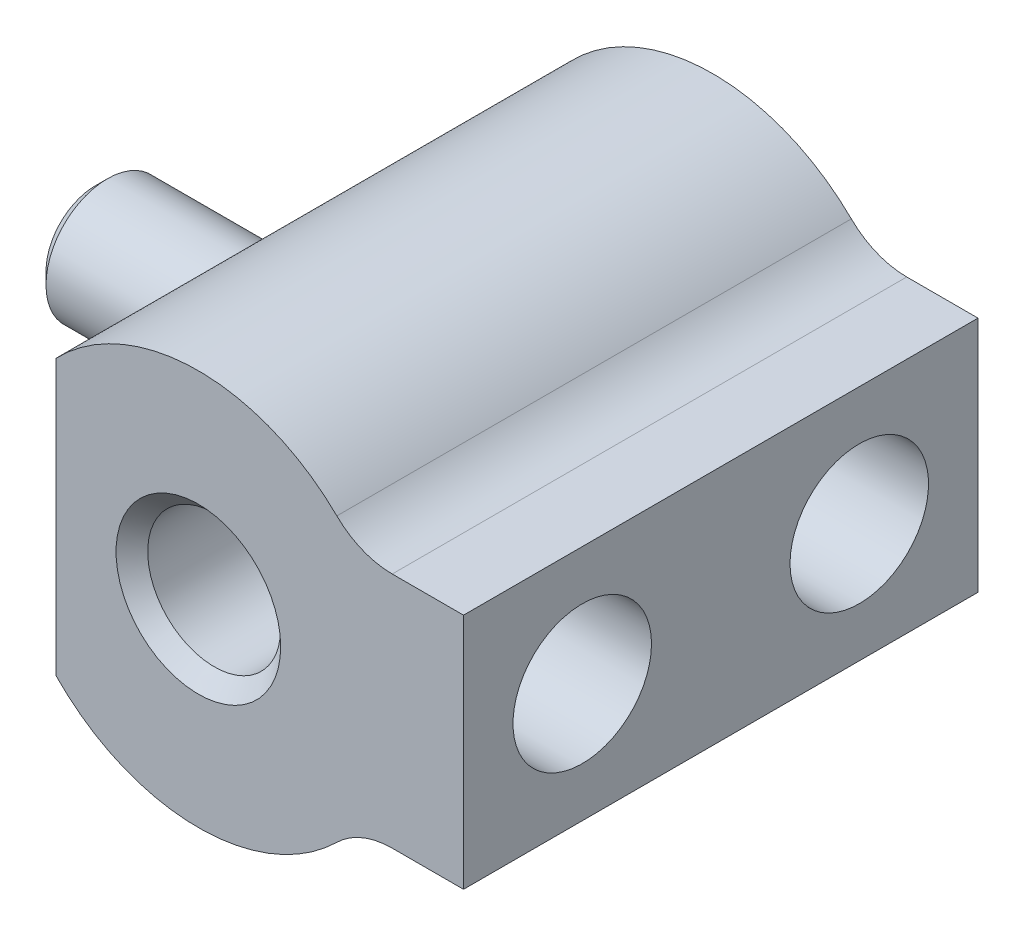
ISO-10303-21;
HEADER;
FILE_DESCRIPTION(('STEP AP214'),'2;1');
FILE_NAME('part.step','',(''),(''),'','','');
FILE_SCHEMA(('AUTOMOTIVE_DESIGN { 1 0 10303 214 1 1 1 1 }'));
ENDSEC;
DATA;
#1=APPLICATION_CONTEXT('core data for automotive mechanical design processes');
#2=APPLICATION_PROTOCOL_DEFINITION('international standard','automotive_design',2000,#1);
#3=PRODUCT_CONTEXT('',#1,'mechanical');
#4=PRODUCT('Part','Part','',(#3));
#5=PRODUCT_RELATED_PRODUCT_CATEGORY('part','',(#4));
#6=PRODUCT_DEFINITION_FORMATION('','',#4);
#7=PRODUCT_DEFINITION_CONTEXT('part definition',#1,'design');
#8=PRODUCT_DEFINITION('design','',#6,#7);
#9=PRODUCT_DEFINITION_SHAPE('','',#8);
#10=(LENGTH_UNIT() NAMED_UNIT(*) SI_UNIT(.MILLI.,.METRE.));
#11=(NAMED_UNIT(*) PLANE_ANGLE_UNIT() SI_UNIT($,.RADIAN.));
#12=(NAMED_UNIT(*) SI_UNIT($,.STERADIAN.) SOLID_ANGLE_UNIT());
#13=UNCERTAINTY_MEASURE_WITH_UNIT(LENGTH_MEASURE(1.E-05),#10,'distance_accuracy_value','');
#14=(GEOMETRIC_REPRESENTATION_CONTEXT(3) GLOBAL_UNCERTAINTY_ASSIGNED_CONTEXT((#13)) GLOBAL_UNIT_ASSIGNED_CONTEXT((#10,
#11,#12)) REPRESENTATION_CONTEXT('',''));
#15=CARTESIAN_POINT('',(0.,0.,0.));
#16=DIRECTION('',(0.,0.,1.));
#17=DIRECTION('',(1.,0.,0.));
#18=AXIS2_PLACEMENT_3D('',#15,#16,#17);
#19=CARTESIAN_POINT('',(0.,0.,8.255));
#20=DIRECTION('',(0.,0.,-1.));
#21=DIRECTION('',(-1.,0.,0.));
#22=AXIS2_PLACEMENT_3D('',#19,#20,#21);
#23=CYLINDRICAL_SURFACE('',#22,2.1336);
#24=CARTESIAN_POINT('',(0.,0.,-7.747));
#25=DIRECTION('',(0.,0.,1.));
#26=DIRECTION('',(1.,0.,0.));
#27=AXIS2_PLACEMENT_3D('',#24,#25,#26);
#28=CIRCLE('',#27,2.1336);
#29=CARTESIAN_POINT('',(2.1336,0.,-7.747));
#30=VERTEX_POINT('',#29);
#31=EDGE_CURVE('E236',#30,#30,#28,.F.);
#32=ORIENTED_EDGE('',*,*,#31,.T.);
#33=EDGE_LOOP('',(#32));
#34=FACE_BOUND('',#33,.T.);
#35=CARTESIAN_POINT('',(0.,0.,7.747));
#36=DIRECTION('',(0.,0.,1.));
#37=DIRECTION('',(1.,0.,0.));
#38=AXIS2_PLACEMENT_3D('',#35,#36,#37);
#39=CIRCLE('',#38,2.1336);
#40=CARTESIAN_POINT('',(2.1336,0.,7.747));
#41=VERTEX_POINT('',#40);
#42=EDGE_CURVE('E239',#41,#41,#39,.T.);
#43=ORIENTED_EDGE('',*,*,#42,.T.);
#44=EDGE_LOOP('',(#43));
#45=FACE_BOUND('',#44,.T.);
#46=DIRECTION('',(0.,0.,-1.));
#47=VECTOR('',#46,1.);
#48=CARTESIAN_POINT('',(0.254000000000001,2.11842700133849,8.255));
#49=LINE('',#48,#47);
#50=CARTESIAN_POINT('',(0.254000000000001,2.11842700133849,-3.77285917398212));
#51=VERTEX_POINT('',#50);
#52=CARTESIAN_POINT('',(0.254000000000001,2.11842700133849,-5.11714082601788));
#53=VERTEX_POINT('',#52);
#54=EDGE_CURVE('E140',#51,#53,#49,.T.);
#55=ORIENTED_EDGE('',*,*,#54,.F.);
#56=CARTESIAN_POINT('',(0.254000000000001,-2.11842700133849,-3.77285917398212));
#57=CARTESIAN_POINT('',(0.284497726513126,-2.11476508358728,-3.76130225564285));
#58=CARTESIAN_POINT('',(0.314301585260691,-2.11052932536651,-3.74829423895303));
#59=CARTESIAN_POINT('',(0.372620729820116,-2.10101831848651,-3.72012513719613));
#60=CARTESIAN_POINT('',(0.401138982108592,-2.09574563121546,-3.7049693826705));
#61=CARTESIAN_POINT('',(0.484821274022645,-2.0785658482495,-3.65747656742434));
#62=CARTESIAN_POINT('',(0.538444873371715,-2.06525449863602,-3.622970850389));
#63=CARTESIAN_POINT('',(0.642761600736332,-2.03520243855964,-3.55113931172342));
#64=CARTESIAN_POINT('',(0.693451393948892,-2.01845792017134,-3.51381038798021));
#65=CARTESIAN_POINT('',(0.792652325157151,-1.98160352589507,-3.43775378853053));
#66=CARTESIAN_POINT('',(0.841159327820026,-1.96148757733932,-3.39902368952789));
#67=CARTESIAN_POINT('',(0.954625020785567,-1.9095024874826,-3.30608354895131));
#68=CARTESIAN_POINT('',(1.01871197528451,-1.87609286391416,-3.25166526572289));
#69=CARTESIAN_POINT('',(1.14354262774209,-1.80271820436528,-3.14346517470374));
#70=CARTESIAN_POINT('',(1.20428735398698,-1.76275519986278,-3.08968317519365));
#71=CARTESIAN_POINT('',(1.32231897954873,-1.67603183562801,-2.98379969818455));
#72=CARTESIAN_POINT('',(1.37960599616076,-1.62927170665682,-2.9316981637074));
#73=CARTESIAN_POINT('',(1.49023593701094,-1.52873448760779,-2.8301998751588));
#74=CARTESIAN_POINT('',(1.54358060793432,-1.47496053461058,-2.78080192579147));
#75=CARTESIAN_POINT('',(1.66083429258304,-1.34306059997673,-2.67157202157172));
#76=CARTESIAN_POINT('',(1.72317192397771,-1.26244667536564,-2.61300165478769));
#77=CARTESIAN_POINT('',(1.83769569023805,-1.08898220923795,-2.50488921213854));
#78=CARTESIAN_POINT('',(1.88990133924685,-0.996155779627571,-2.45532979310726));
#79=CARTESIAN_POINT('',(1.97329530207202,-0.816320724260547,-2.37593752003198));
#80=CARTESIAN_POINT('',(2.00656349738447,-0.731143100130303,-2.34416971449288));
#81=CARTESIAN_POINT('',(2.06242125748279,-0.554298040716037,-2.29075495223228));
#82=CARTESIAN_POINT('',(2.08501592131903,-0.462633728422208,-2.26910316285564));
#83=CARTESIAN_POINT('',(2.1180268647838,-0.274541547429137,-2.23745095306477));
#84=CARTESIAN_POINT('',(2.12836925085294,-0.178088394409263,-2.22752122974921));
#85=CARTESIAN_POINT('',(2.13574298453763,0.0157840761503962,-2.22044294010863));
#86=CARTESIAN_POINT('',(2.13277913514447,0.113203032408554,-2.22328976198811));
#87=CARTESIAN_POINT('',(2.11477528345377,0.295900926984991,-2.24056660051602));
#88=CARTESIAN_POINT('',(2.10096918031501,0.381421615394019,-2.25381304736528));
#89=CARTESIAN_POINT('',(2.06371339896395,0.548317518112024,-2.28950889384937));
#90=CARTESIAN_POINT('',(2.04026107221658,0.629691586994067,-2.31196082100031));
#91=CARTESIAN_POINT('',(1.98339285070981,0.791304035000947,-2.3662913469797));
#92=CARTESIAN_POINT('',(1.94948113513619,0.871207411558688,-2.39863817624372));
#93=CARTESIAN_POINT('',(1.87391273131565,1.02369500887622,-2.47049502441226));
#94=CARTESIAN_POINT('',(1.83225567749034,1.09627888390752,-2.51000538143164));
#95=CARTESIAN_POINT('',(1.71778191133392,1.27190500856808,-2.61811663738416));
#96=CARTESIAN_POINT('',(1.64047947638096,1.36957234703151,-2.69071564921982));
#97=CARTESIAN_POINT('',(1.47436571137963,1.54705861541528,-2.84499017859032));
#98=CARTESIAN_POINT('',(1.38549535449711,1.6267798499281,-2.92671191858448));
#99=CARTESIAN_POINT('',(1.23342625675972,1.74251369121458,-3.06371173979288));
#100=CARTESIAN_POINT('',(1.17287944060051,1.78379071895387,-3.11759978827124));
#101=CARTESIAN_POINT('',(1.04835108074085,1.85971457704818,-3.22624739623769));
#102=CARTESIAN_POINT('',(0.984366146180727,1.89435470213644,-3.28100777719194));
#103=CARTESIAN_POINT('',(0.853378231499445,1.95683884950344,-3.38945769085318));
#104=CARTESIAN_POINT('',(0.786406343077043,1.98473936349651,-3.44315239488886));
#105=CARTESIAN_POINT('',(0.648096513457933,2.03411586114124,-3.54768257061331));
#106=CARTESIAN_POINT('',(0.576767042666768,2.05560385922047,-3.59852324256345));
#107=CARTESIAN_POINT('',(0.463003686190268,2.08314328730719,-3.66994361914462));
#108=CARTESIAN_POINT('',(0.423025543298013,2.091667599538,-3.69338569111904));
#109=CARTESIAN_POINT('',(0.340526726360431,2.10666345031393,-3.73646307678603));
#110=CARTESIAN_POINT('',(0.29799646847149,2.11312659042192,-3.75608269241052));
#111=CARTESIAN_POINT('',(0.254000000000001,2.11842700133849,-3.77285917398212));
#112=B_SPLINE_CURVE_WITH_KNOTS('',3,(#56,#57,#58,#59,#60,#61,#62,#63,#64,#65,#66,#67,#68,#69,
#70,#71,#72,#73,#74,#75,#76,#77,#78,#79,#80,#81,#82,#83,#84,#85,#86,#87,#88,#89,#90,#91,#92,#93,
#94,#95,#96,#97,#98,#99,#100,#101,#102,#103,#104,#105,#106,#107,#108,#109,#110,#111),
.UNSPECIFIED.,.F.,.F.,(4,2,2,2,2,2,2,2,2,2,2,2,2,2,2,2,2,2,2,2,2,2,2,2,2,2,2,4),(0.,
0.0983109108433526,0.196381960358486,0.391441397818501,0.586718368840058,0.782350931974347,
1.05344860485957,1.32446239867817,1.5954669937779,1.86635078937374,2.21773209379373,
2.56842977337826,2.85767248591872,3.14677687887526,3.43761612683996,3.72835040251232,
3.9900882394096,4.25189798891341,4.52877819243729,4.80567146796916,5.23580664560347,
5.66822963348432,5.94082807449065,6.21370048617005,6.48419945723306,6.7541883954234,
6.89532772342514,7.03703499909331),.UNSPECIFIED.);
#113=CARTESIAN_POINT('',(0.254000000000001,-2.11842700133849,-3.77285917398212));
#114=VERTEX_POINT('',#113);
#115=EDGE_CURVE('E147',#114,#51,#112,.T.);
#116=ORIENTED_EDGE('',*,*,#115,.F.);
#117=DIRECTION('',(0.,0.,-1.));
#118=VECTOR('',#117,1.);
#119=CARTESIAN_POINT('',(0.254000000000001,-2.11842700133849,8.255));
#120=LINE('',#119,#118);
#121=CARTESIAN_POINT('',(0.254000000000001,-2.11842700133849,-5.11714082601788));
#122=VERTEX_POINT('',#121);
#123=EDGE_CURVE('E132',#122,#114,#120,.F.);
#124=ORIENTED_EDGE('',*,*,#123,.F.);
#125=CARTESIAN_POINT('',(0.254000000000001,2.11842700133849,-5.11714082601788));
#126=CARTESIAN_POINT('',(0.284497726513126,2.11476508358728,-5.12869774435715));
#127=CARTESIAN_POINT('',(0.314301585260691,2.11052932536651,-5.14170576104697));
#128=CARTESIAN_POINT('',(0.372620729820116,2.10101831848651,-5.16987486280387));
#129=CARTESIAN_POINT('',(0.401138982108592,2.09574563121546,-5.1850306173295));
#130=CARTESIAN_POINT('',(0.484821274022645,2.0785658482495,-5.23252343257565));
#131=CARTESIAN_POINT('',(0.538444873371714,2.06525449863602,-5.26702914961099));
#132=CARTESIAN_POINT('',(0.642761600736332,2.03520243855964,-5.33886068827658));
#133=CARTESIAN_POINT('',(0.693451393948892,2.01845792017134,-5.37618961201979));
#134=CARTESIAN_POINT('',(0.792652325157151,1.98160352589507,-5.45224621146946));
#135=CARTESIAN_POINT('',(0.841159327820026,1.96148757733932,-5.49097631047211));
#136=CARTESIAN_POINT('',(0.954625020785567,1.9095024874826,-5.58391645104869));
#137=CARTESIAN_POINT('',(1.01871197528451,1.87609286391416,-5.6383347342771));
#138=CARTESIAN_POINT('',(1.14354262774209,1.80271820436528,-5.74653482529626));
#139=CARTESIAN_POINT('',(1.20428735398698,1.76275519986278,-5.80031682480635));
#140=CARTESIAN_POINT('',(1.32231897954873,1.67603183562801,-5.90620030181545));
#141=CARTESIAN_POINT('',(1.37960599616076,1.62927170665682,-5.9583018362926));
#142=CARTESIAN_POINT('',(1.49023593701094,1.52873448760779,-6.0598001248412));
#143=CARTESIAN_POINT('',(1.54358060793432,1.47496053461058,-6.10919807420852));
#144=CARTESIAN_POINT('',(1.66083429258304,1.34306059997673,-6.21842797842828));
#145=CARTESIAN_POINT('',(1.72317192397771,1.26244667536564,-6.2769983452123));
#146=CARTESIAN_POINT('',(1.83769569023805,1.08898220923795,-6.38511078786146));
#147=CARTESIAN_POINT('',(1.88990133924685,0.996155779627572,-6.43467020689273));
#148=CARTESIAN_POINT('',(1.97329530207202,0.816320724260548,-6.51406247996802));
#149=CARTESIAN_POINT('',(2.00656349738447,0.731143100130304,-6.54583028550711));
#150=CARTESIAN_POINT('',(2.06242125748279,0.554298040716038,-6.59924504776772));
#151=CARTESIAN_POINT('',(2.08501592131903,0.462633728422209,-6.62089683714436));
#152=CARTESIAN_POINT('',(2.1180268647838,0.274541547429139,-6.65254904693523));
#153=CARTESIAN_POINT('',(2.12836925085294,0.178088394409264,-6.66247877025079));
#154=CARTESIAN_POINT('',(2.13574298453763,-0.0157840761503949,-6.66955705989137));
#155=CARTESIAN_POINT('',(2.13277913514447,-0.113203032408552,-6.66671023801189));
#156=CARTESIAN_POINT('',(2.11477528345377,-0.29590092698499,-6.64943339948397));
#157=CARTESIAN_POINT('',(2.10096918031501,-0.381421615394018,-6.63618695263472));
#158=CARTESIAN_POINT('',(2.06371339896395,-0.548317518112023,-6.60049110615063));
#159=CARTESIAN_POINT('',(2.04026107221658,-0.629691586994066,-6.57803917899969));
#160=CARTESIAN_POINT('',(1.98339285070981,-0.791304035000946,-6.5237086530203));
#161=CARTESIAN_POINT('',(1.94948113513619,-0.871207411558687,-6.49136182375628));
#162=CARTESIAN_POINT('',(1.87391273131565,-1.02369500887622,-6.41950497558773));
#163=CARTESIAN_POINT('',(1.83225567749035,-1.09627888390752,-6.37999461856835));
#164=CARTESIAN_POINT('',(1.71778191133393,-1.27190500856807,-6.27188336261584));
#165=CARTESIAN_POINT('',(1.64047947638096,-1.36957234703151,-6.19928435078018));
#166=CARTESIAN_POINT('',(1.47436571137963,-1.54705861541528,-6.04500982140968));
#167=CARTESIAN_POINT('',(1.38549535449711,-1.6267798499281,-5.96328808141552));
#168=CARTESIAN_POINT('',(1.23342625675972,-1.74251369121458,-5.82628826020712));
#169=CARTESIAN_POINT('',(1.17287944060051,-1.78379071895387,-5.77240021172876));
#170=CARTESIAN_POINT('',(1.04835108074085,-1.85971457704818,-5.66375260376231));
#171=CARTESIAN_POINT('',(0.984366146180728,-1.89435470213644,-5.60899222280806));
#172=CARTESIAN_POINT('',(0.853378231499446,-1.95683884950344,-5.50054230914682));
#173=CARTESIAN_POINT('',(0.786406343077045,-1.9847393634965,-5.44684760511114));
#174=CARTESIAN_POINT('',(0.648096513457935,-2.03411586114124,-5.34231742938669));
#175=CARTESIAN_POINT('',(0.57676704266677,-2.05560385922047,-5.29147675743656));
#176=CARTESIAN_POINT('',(0.463003686190271,-2.08314328730719,-5.22005638085538));
#177=CARTESIAN_POINT('',(0.423025543298015,-2.091667599538,-5.19661430888096));
#178=CARTESIAN_POINT('',(0.340526726360432,-2.10666345031393,-5.15353692321397));
#179=CARTESIAN_POINT('',(0.297996468471491,-2.11312659042192,-5.13391730758948));
#180=CARTESIAN_POINT('',(0.254000000000001,-2.11842700133849,-5.11714082601788));
#181=B_SPLINE_CURVE_WITH_KNOTS('',3,(#125,#126,#127,#128,#129,#130,#131,#132,#133,#134,#135,
#136,#137,#138,#139,#140,#141,#142,#143,#144,#145,#146,#147,#148,#149,#150,#151,#152,#153,#154,
#155,#156,#157,#158,#159,#160,#161,#162,#163,#164,#165,#166,#167,#168,#169,#170,#171,#172,#173,
#174,#175,#176,#177,#178,#179,#180),.UNSPECIFIED.,.F.,.F.,(4,2,2,2,2,2,2,2,2,2,2,2,2,2,2,2,2,2,
2,2,2,2,2,2,2,2,2,4),(0.,0.0983109108433523,0.196381960358486,0.391441397818501,
0.586718368840057,0.782350931974348,1.05344860485957,1.32446239867818,1.5954669937779,
1.86635078937374,2.21773209379373,2.56842977337825,2.85767248591872,3.14677687887526,
3.43761612683996,3.72835040251232,3.9900882394096,4.25189798891341,4.52877819243729,
4.80567146796916,5.23580664560347,5.66822963348432,5.94082807449065,6.21370048617004,
6.48419945723306,6.7541883954234,6.89532772342514,7.03703499909331),.UNSPECIFIED.);
#182=EDGE_CURVE('E149',#53,#122,#181,.T.);
#183=ORIENTED_EDGE('',*,*,#182,.F.);
#184=EDGE_LOOP('',(#55,#116,#124,#183));
#185=FACE_BOUND('',#184,.T.);
#186=CARTESIAN_POINT('',(0.254000000000001,-2.11842700133849,5.11714082601788));
#187=CARTESIAN_POINT('',(0.284497726513126,-2.11476508358728,5.12869774435715));
#188=CARTESIAN_POINT('',(0.314301585260691,-2.11052932536651,5.14170576104697));
#189=CARTESIAN_POINT('',(0.372620729820116,-2.10101831848651,5.16987486280387));
#190=CARTESIAN_POINT('',(0.401138982108592,-2.09574563121546,5.1850306173295));
#191=CARTESIAN_POINT('',(0.484821274022645,-2.0785658482495,5.23252343257565));
#192=CARTESIAN_POINT('',(0.538444873371714,-2.06525449863602,5.26702914961099));
#193=CARTESIAN_POINT('',(0.642761600736332,-2.03520243855964,5.33886068827658));
#194=CARTESIAN_POINT('',(0.693451393948892,-2.01845792017134,5.37618961201979));
#195=CARTESIAN_POINT('',(0.792652325157151,-1.98160352589507,5.45224621146946));
#196=CARTESIAN_POINT('',(0.841159327820026,-1.96148757733932,5.49097631047211));
#197=CARTESIAN_POINT('',(0.954625020785567,-1.9095024874826,5.58391645104869));
#198=CARTESIAN_POINT('',(1.01871197528451,-1.87609286391416,5.6383347342771));
#199=CARTESIAN_POINT('',(1.14354262774209,-1.80271820436528,5.74653482529626));
#200=CARTESIAN_POINT('',(1.20428735398698,-1.76275519986278,5.80031682480635));
#201=CARTESIAN_POINT('',(1.32231897954873,-1.67603183562801,5.90620030181545));
#202=CARTESIAN_POINT('',(1.37960599616076,-1.62927170665682,5.9583018362926));
#203=CARTESIAN_POINT('',(1.49023593701094,-1.52873448760779,6.0598001248412));
#204=CARTESIAN_POINT('',(1.54358060793432,-1.47496053461058,6.10919807420852));
#205=CARTESIAN_POINT('',(1.66083429258304,-1.34306059997673,6.21842797842828));
#206=CARTESIAN_POINT('',(1.72317192397771,-1.26244667536564,6.2769983452123));
#207=CARTESIAN_POINT('',(1.83769569023805,-1.08898220923795,6.38511078786146));
#208=CARTESIAN_POINT('',(1.88990133924685,-0.996155779627572,6.43467020689273));
#209=CARTESIAN_POINT('',(1.97329530207202,-0.816320724260548,6.51406247996802));
#210=CARTESIAN_POINT('',(2.00656349738447,-0.731143100130304,6.54583028550711));
#211=CARTESIAN_POINT('',(2.06242125748279,-0.554298040716038,6.59924504776772));
#212=CARTESIAN_POINT('',(2.08501592131903,-0.462633728422209,6.62089683714436));
#213=CARTESIAN_POINT('',(2.1180268647838,-0.274541547429139,6.65254904693523));
#214=CARTESIAN_POINT('',(2.12836925085294,-0.178088394409264,6.66247877025079));
#215=CARTESIAN_POINT('',(2.13574298453763,0.0157840761503949,6.66955705989137));
#216=CARTESIAN_POINT('',(2.13277913514447,0.113203032408552,6.66671023801189));
#217=CARTESIAN_POINT('',(2.11477528345377,0.29590092698499,6.64943339948397));
#218=CARTESIAN_POINT('',(2.10096918031501,0.381421615394018,6.63618695263472));
#219=CARTESIAN_POINT('',(2.06371339896395,0.548317518112023,6.60049110615063));
#220=CARTESIAN_POINT('',(2.04026107221658,0.629691586994066,6.57803917899969));
#221=CARTESIAN_POINT('',(1.98339285070981,0.791304035000946,6.5237086530203));
#222=CARTESIAN_POINT('',(1.94948113513619,0.871207411558687,6.49136182375628));
#223=CARTESIAN_POINT('',(1.87391273131565,1.02369500887622,6.41950497558773));
#224=CARTESIAN_POINT('',(1.83225567749035,1.09627888390752,6.37999461856835));
#225=CARTESIAN_POINT('',(1.71778191133393,1.27190500856807,6.27188336261584));
#226=CARTESIAN_POINT('',(1.64047947638096,1.36957234703151,6.19928435078018));
#227=CARTESIAN_POINT('',(1.47436571137963,1.54705861541528,6.04500982140968));
#228=CARTESIAN_POINT('',(1.38549535449711,1.6267798499281,5.96328808141552));
#229=CARTESIAN_POINT('',(1.23342625675972,1.74251369121458,5.82628826020712));
#230=CARTESIAN_POINT('',(1.17287944060051,1.78379071895387,5.77240021172876));
#231=CARTESIAN_POINT('',(1.04835108074085,1.85971457704818,5.66375260376231));
#232=CARTESIAN_POINT('',(0.984366146180728,1.89435470213644,5.60899222280806));
#233=CARTESIAN_POINT('',(0.853378231499446,1.95683884950344,5.50054230914682));
#234=CARTESIAN_POINT('',(0.786406343077045,1.9847393634965,5.44684760511114));
#235=CARTESIAN_POINT('',(0.648096513457935,2.03411586114124,5.34231742938669));
#236=CARTESIAN_POINT('',(0.57676704266677,2.05560385922047,5.29147675743656));
#237=CARTESIAN_POINT('',(0.463003686190271,2.08314328730719,5.22005638085538));
#238=CARTESIAN_POINT('',(0.423025543298015,2.091667599538,5.19661430888096));
#239=CARTESIAN_POINT('',(0.340526726360432,2.10666345031393,5.15353692321397));
#240=CARTESIAN_POINT('',(0.297996468471491,2.11312659042192,5.13391730758948));
#241=CARTESIAN_POINT('',(0.254000000000001,2.11842700133849,5.11714082601788));
#242=B_SPLINE_CURVE_WITH_KNOTS('',3,(#186,#187,#188,#189,#190,#191,#192,#193,#194,#195,#196,
#197,#198,#199,#200,#201,#202,#203,#204,#205,#206,#207,#208,#209,#210,#211,#212,#213,#214,#215,
#216,#217,#218,#219,#220,#221,#222,#223,#224,#225,#226,#227,#228,#229,#230,#231,#232,#233,#234,
#235,#236,#237,#238,#239,#240,#241),.UNSPECIFIED.,.F.,.F.,(4,2,2,2,2,2,2,2,2,2,2,2,2,2,2,2,2,2,
2,2,2,2,2,2,2,2,2,4),(0.,0.0983109108433523,0.196381960358486,0.391441397818501,
0.586718368840057,0.782350931974348,1.05344860485957,1.32446239867818,1.5954669937779,
1.86635078937374,2.21773209379373,2.56842977337825,2.85767248591872,3.14677687887526,
3.43761612683996,3.72835040251232,3.9900882394096,4.25189798891341,4.52877819243729,
4.80567146796916,5.23580664560347,5.66822963348432,5.94082807449065,6.21370048617004,
6.48419945723306,6.7541883954234,6.89532772342514,7.03703499909331),.UNSPECIFIED.);
#243=CARTESIAN_POINT('',(0.254000000000001,-2.11842700133849,5.11714082601788));
#244=VERTEX_POINT('',#243);
#245=CARTESIAN_POINT('',(0.254000000000001,2.11842700133849,5.11714082601788));
#246=VERTEX_POINT('',#245);
#247=EDGE_CURVE('E157',#244,#246,#242,.T.);
#248=ORIENTED_EDGE('',*,*,#247,.F.);
#249=DIRECTION('',(0.,0.,-1.));
#250=VECTOR('',#249,1.);
#251=CARTESIAN_POINT('',(0.254000000000001,-2.11842700133849,8.255));
#252=LINE('',#251,#250);
#253=CARTESIAN_POINT('',(0.254000000000001,-2.11842700133849,3.77285917398212));
#254=VERTEX_POINT('',#253);
#255=EDGE_CURVE('E246',#244,#254,#252,.T.);
#256=ORIENTED_EDGE('',*,*,#255,.T.);
#257=CARTESIAN_POINT('',(0.254000000000001,2.11842700133849,3.77285917398212));
#258=CARTESIAN_POINT('',(0.284497726513126,2.11476508358728,3.76130225564285));
#259=CARTESIAN_POINT('',(0.314301585260691,2.11052932536651,3.74829423895303));
#260=CARTESIAN_POINT('',(0.372620729820116,2.10101831848651,3.72012513719613));
#261=CARTESIAN_POINT('',(0.401138982108592,2.09574563121546,3.7049693826705));
#262=CARTESIAN_POINT('',(0.484821274022645,2.0785658482495,3.65747656742434));
#263=CARTESIAN_POINT('',(0.538444873371715,2.06525449863602,3.622970850389));
#264=CARTESIAN_POINT('',(0.642761600736332,2.03520243855964,3.55113931172342));
#265=CARTESIAN_POINT('',(0.693451393948892,2.01845792017134,3.51381038798021));
#266=CARTESIAN_POINT('',(0.792652325157151,1.98160352589507,3.43775378853053));
#267=CARTESIAN_POINT('',(0.841159327820026,1.96148757733932,3.39902368952789));
#268=CARTESIAN_POINT('',(0.954625020785567,1.9095024874826,3.30608354895131));
#269=CARTESIAN_POINT('',(1.01871197528451,1.87609286391416,3.25166526572289));
#270=CARTESIAN_POINT('',(1.14354262774209,1.80271820436528,3.14346517470374));
#271=CARTESIAN_POINT('',(1.20428735398698,1.76275519986278,3.08968317519365));
#272=CARTESIAN_POINT('',(1.32231897954873,1.67603183562801,2.98379969818455));
#273=CARTESIAN_POINT('',(1.37960599616076,1.62927170665682,2.9316981637074));
#274=CARTESIAN_POINT('',(1.49023593701094,1.52873448760779,2.8301998751588));
#275=CARTESIAN_POINT('',(1.54358060793432,1.47496053461058,2.78080192579147));
#276=CARTESIAN_POINT('',(1.66083429258304,1.34306059997673,2.67157202157172));
#277=CARTESIAN_POINT('',(1.72317192397771,1.26244667536564,2.61300165478769));
#278=CARTESIAN_POINT('',(1.83769569023805,1.08898220923795,2.50488921213854));
#279=CARTESIAN_POINT('',(1.88990133924685,0.996155779627571,2.45532979310726));
#280=CARTESIAN_POINT('',(1.97329530207202,0.816320724260547,2.37593752003198));
#281=CARTESIAN_POINT('',(2.00656349738447,0.731143100130303,2.34416971449288));
#282=CARTESIAN_POINT('',(2.06242125748279,0.554298040716037,2.29075495223228));
#283=CARTESIAN_POINT('',(2.08501592131903,0.462633728422208,2.26910316285564));
#284=CARTESIAN_POINT('',(2.1180268647838,0.274541547429137,2.23745095306477));
#285=CARTESIAN_POINT('',(2.12836925085294,0.178088394409263,2.22752122974921));
#286=CARTESIAN_POINT('',(2.13574298453763,-0.0157840761503962,2.22044294010863));
#287=CARTESIAN_POINT('',(2.13277913514447,-0.113203032408554,2.22328976198811));
#288=CARTESIAN_POINT('',(2.11477528345377,-0.295900926984991,2.24056660051602));
#289=CARTESIAN_POINT('',(2.10096918031501,-0.381421615394019,2.25381304736528));
#290=CARTESIAN_POINT('',(2.06371339896395,-0.548317518112024,2.28950889384937));
#291=CARTESIAN_POINT('',(2.04026107221658,-0.629691586994067,2.31196082100031));
#292=CARTESIAN_POINT('',(1.98339285070981,-0.791304035000947,2.3662913469797));
#293=CARTESIAN_POINT('',(1.94948113513619,-0.871207411558688,2.39863817624372));
#294=CARTESIAN_POINT('',(1.87391273131565,-1.02369500887622,2.47049502441226));
#295=CARTESIAN_POINT('',(1.83225567749034,-1.09627888390752,2.51000538143164));
#296=CARTESIAN_POINT('',(1.71778191133392,-1.27190500856808,2.61811663738416));
#297=CARTESIAN_POINT('',(1.64047947638096,-1.36957234703151,2.69071564921982));
#298=CARTESIAN_POINT('',(1.47436571137963,-1.54705861541528,2.84499017859032));
#299=CARTESIAN_POINT('',(1.38549535449711,-1.6267798499281,2.92671191858448));
#300=CARTESIAN_POINT('',(1.23342625675972,-1.74251369121458,3.06371173979288));
#301=CARTESIAN_POINT('',(1.17287944060051,-1.78379071895387,3.11759978827124));
#302=CARTESIAN_POINT('',(1.04835108074085,-1.85971457704818,3.22624739623769));
#303=CARTESIAN_POINT('',(0.984366146180727,-1.89435470213644,3.28100777719194));
#304=CARTESIAN_POINT('',(0.853378231499445,-1.95683884950344,3.38945769085318));
#305=CARTESIAN_POINT('',(0.786406343077043,-1.98473936349651,3.44315239488886));
#306=CARTESIAN_POINT('',(0.648096513457933,-2.03411586114124,3.54768257061331));
#307=CARTESIAN_POINT('',(0.576767042666768,-2.05560385922047,3.59852324256345));
#308=CARTESIAN_POINT('',(0.463003686190268,-2.08314328730719,3.66994361914462));
#309=CARTESIAN_POINT('',(0.423025543298013,-2.091667599538,3.69338569111904));
#310=CARTESIAN_POINT('',(0.340526726360431,-2.10666345031393,3.73646307678603));
#311=CARTESIAN_POINT('',(0.29799646847149,-2.11312659042192,3.75608269241052));
#312=CARTESIAN_POINT('',(0.254000000000001,-2.11842700133849,3.77285917398212));
#313=B_SPLINE_CURVE_WITH_KNOTS('',3,(#257,#258,#259,#260,#261,#262,#263,#264,#265,#266,#267,
#268,#269,#270,#271,#272,#273,#274,#275,#276,#277,#278,#279,#280,#281,#282,#283,#284,#285,#286,
#287,#288,#289,#290,#291,#292,#293,#294,#295,#296,#297,#298,#299,#300,#301,#302,#303,#304,#305,
#306,#307,#308,#309,#310,#311,#312),.UNSPECIFIED.,.F.,.F.,(4,2,2,2,2,2,2,2,2,2,2,2,2,2,2,2,2,2,
2,2,2,2,2,2,2,2,2,4),(0.,0.0983109108433526,0.196381960358486,0.391441397818501,
0.586718368840058,0.782350931974347,1.05344860485957,1.32446239867817,1.5954669937779,
1.86635078937374,2.21773209379373,2.56842977337826,2.85767248591872,3.14677687887526,
3.43761612683996,3.72835040251232,3.9900882394096,4.25189798891341,4.52877819243729,
4.80567146796916,5.23580664560347,5.66822963348432,5.94082807449065,6.21370048617005,
6.48419945723306,6.7541883954234,6.89532772342514,7.03703499909331),.UNSPECIFIED.);
#314=CARTESIAN_POINT('',(0.254000000000001,2.11842700133849,3.77285917398212));
#315=VERTEX_POINT('',#314);
#316=EDGE_CURVE('E155',#315,#254,#313,.T.);
#317=ORIENTED_EDGE('',*,*,#316,.F.);
#318=DIRECTION('',(0.,0.,-1.));
#319=VECTOR('',#318,1.);
#320=CARTESIAN_POINT('',(0.254000000000001,2.11842700133849,8.255));
#321=LINE('',#320,#319);
#322=EDGE_CURVE('E320',#315,#246,#321,.F.);
#323=ORIENTED_EDGE('',*,*,#322,.T.);
#324=EDGE_LOOP('',(#248,#256,#317,#323));
#325=FACE_BOUND('',#324,.T.);
#326=ADVANCED_FACE('F46',(#34,#45,#185,#325),#23,.F.);
#327=CARTESIAN_POINT('',(0.,0.,8.255));
#328=DIRECTION('',(0.,0.,-1.));
#329=DIRECTION('',(-1.,0.,0.));
#330=AXIS2_PLACEMENT_3D('',#327,#328,#329);
#331=CYLINDRICAL_SURFACE('',#330,6.35);
#332=CARTESIAN_POINT('',(0.,0.,-8.255));
#333=DIRECTION('',(0.,0.,1.));
#334=DIRECTION('',(1.,0.,0.));
#335=AXIS2_PLACEMENT_3D('',#332,#333,#334);
#336=CIRCLE('',#335,6.35);
#337=CARTESIAN_POINT('',(-4.572,-4.40673529951596,-8.255));
#338=VERTEX_POINT('',#337);
#339=CARTESIAN_POINT('',(4.44407424762091,-4.53571428571429,-8.255));
#340=VERTEX_POINT('',#339);
#341=EDGE_CURVE('E270',#338,#340,#336,.T.);
#342=ORIENTED_EDGE('',*,*,#341,.T.);
#343=DIRECTION('',(0.,0.,-1.));
#344=VECTOR('',#343,1.);
#345=CARTESIAN_POINT('',(4.44407424762091,-4.53571428571429,8.255));
#346=LINE('',#345,#344);
#347=CARTESIAN_POINT('',(4.44407424762091,-4.53571428571429,8.255));
#348=VERTEX_POINT('',#347);
#349=EDGE_CURVE('E252',#340,#348,#346,.F.);
#350=ORIENTED_EDGE('',*,*,#349,.T.);
#351=CARTESIAN_POINT('',(0.,0.,8.255));
#352=DIRECTION('',(0.,0.,1.));
#353=DIRECTION('',(1.,0.,0.));
#354=AXIS2_PLACEMENT_3D('',#351,#352,#353);
#355=CIRCLE('',#354,6.35);
#356=CARTESIAN_POINT('',(-4.572,-4.40673529951596,8.255));
#357=VERTEX_POINT('',#356);
#358=EDGE_CURVE('E290',#357,#348,#355,.T.);
#359=ORIENTED_EDGE('',*,*,#358,.F.);
#360=DIRECTION('',(0.,0.,1.));
#361=VECTOR('',#360,1.);
#362=CARTESIAN_POINT('',(-4.572,-4.40673529951596,-8.255));
#363=LINE('',#362,#361);
#364=EDGE_CURVE('E280',#338,#357,#363,.T.);
#365=ORIENTED_EDGE('',*,*,#364,.F.);
#366=EDGE_LOOP('',(#342,#350,#359,#365));
#367=FACE_BOUND('',#366,.T.);
#368=ADVANCED_FACE('F221',(#367),#331,.T.);
#369=CARTESIAN_POINT('',(0.,0.,8.255));
#370=DIRECTION('',(0.,0.,1.));
#371=DIRECTION('',(1.,0.,0.));
#372=AXIS2_PLACEMENT_3D('',#369,#370,#371);
#373=PLANE('',#372);
#374=CARTESIAN_POINT('',(0.,0.,8.255));
#375=DIRECTION('',(0.,0.,1.));
#376=DIRECTION('',(1.,0.,0.));
#377=AXIS2_PLACEMENT_3D('',#374,#375,#376);
#378=CIRCLE('',#377,2.64159999999999);
#379=CARTESIAN_POINT('',(2.64159999999999,0.,8.255));
#380=VERTEX_POINT('',#379);
#381=EDGE_CURVE('E243',#380,#380,#378,.F.);
#382=ORIENTED_EDGE('',*,*,#381,.T.);
#383=EDGE_LOOP('',(#382));
#384=FACE_BOUND('',#383,.T.);
#385=DIRECTION('',(0.,1.,0.));
#386=VECTOR('',#385,1.);
#387=CARTESIAN_POINT('',(-4.572,4.40673529951596,8.255));
#388=LINE('',#387,#386);
#389=CARTESIAN_POINT('',(-4.572,4.40673529951596,8.255));
#390=VERTEX_POINT('',#389);
#391=EDGE_CURVE('E294',#357,#390,#388,.T.);
#392=ORIENTED_EDGE('',*,*,#391,.F.);
#393=ORIENTED_EDGE('',*,*,#358,.T.);
#394=CARTESIAN_POINT('',(6.22170394666927,-6.35,8.255));
#395=DIRECTION('',(0.,0.,1.));
#396=DIRECTION('',(1.,0.,0.));
#397=AXIS2_PLACEMENT_3D('',#394,#395,#396);
#398=CIRCLE('',#397,2.54);
#399=CARTESIAN_POINT('',(6.22170394666927,-3.81,8.255));
#400=VERTEX_POINT('',#399);
#401=EDGE_CURVE('E261',#348,#400,#398,.F.);
#402=ORIENTED_EDGE('',*,*,#401,.T.);
#403=DIRECTION('',(-1.,0.,0.));
#404=VECTOR('',#403,1.);
#405=CARTESIAN_POINT('',(8.509,-3.81,8.255));
#406=LINE('',#405,#404);
#407=CARTESIAN_POINT('',(8.509,-3.81,8.255));
#408=VERTEX_POINT('',#407);
#409=EDGE_CURVE('E288',#408,#400,#406,.T.);
#410=ORIENTED_EDGE('',*,*,#409,.F.);
#411=DIRECTION('',(0.,-1.,0.));
#412=VECTOR('',#411,1.);
#413=CARTESIAN_POINT('',(8.509,3.81,8.255));
#414=LINE('',#413,#412);
#415=CARTESIAN_POINT('',(8.509,3.81,8.255));
#416=VERTEX_POINT('',#415);
#417=EDGE_CURVE('E346',#416,#408,#414,.T.);
#418=ORIENTED_EDGE('',*,*,#417,.F.);
#419=DIRECTION('',(-1.,0.,0.));
#420=VECTOR('',#419,1.);
#421=CARTESIAN_POINT('',(8.509,3.81,8.255));
#422=LINE('',#421,#420);
#423=CARTESIAN_POINT('',(6.22170394666927,3.81,8.255));
#424=VERTEX_POINT('',#423);
#425=EDGE_CURVE('E292',#416,#424,#422,.T.);
#426=ORIENTED_EDGE('',*,*,#425,.T.);
#427=CARTESIAN_POINT('',(6.22170394666927,6.35,8.255));
#428=DIRECTION('',(0.,0.,1.));
#429=DIRECTION('',(1.,0.,0.));
#430=AXIS2_PLACEMENT_3D('',#427,#428,#429);
#431=CIRCLE('',#430,2.54);
#432=CARTESIAN_POINT('',(4.44407424762091,4.53571428571429,8.255));
#433=VERTEX_POINT('',#432);
#434=EDGE_CURVE('E54',#424,#433,#431,.F.);
#435=ORIENTED_EDGE('',*,*,#434,.T.);
#436=EDGE_CURVE('E307',#433,#390,#355,.T.);
#437=ORIENTED_EDGE('',*,*,#436,.T.);
#438=EDGE_LOOP('',(#392,#393,#402,#410,#418,#426,#435,#437));
#439=FACE_BOUND('',#438,.T.);
#440=ADVANCED_FACE('F231',(#384,#439),#373,.T.);
#441=CARTESIAN_POINT('',(0.,0.,-8.255));
#442=DIRECTION('',(0.,0.,1.));
#443=DIRECTION('',(1.,0.,0.));
#444=AXIS2_PLACEMENT_3D('',#441,#442,#443);
#445=PLANE('',#444);
#446=CARTESIAN_POINT('',(0.,0.,-8.255));
#447=DIRECTION('',(0.,0.,1.));
#448=DIRECTION('',(1.,0.,0.));
#449=AXIS2_PLACEMENT_3D('',#446,#447,#448);
#450=CIRCLE('',#449,2.6416);
#451=CARTESIAN_POINT('',(2.6416,0.,-8.255));
#452=VERTEX_POINT('',#451);
#453=EDGE_CURVE('E241',#452,#452,#450,.T.);
#454=ORIENTED_EDGE('',*,*,#453,.T.);
#455=EDGE_LOOP('',(#454));
#456=FACE_BOUND('',#455,.T.);
#457=ORIENTED_EDGE('',*,*,#341,.F.);
#458=DIRECTION('',(0.,1.,0.));
#459=VECTOR('',#458,1.);
#460=CARTESIAN_POINT('',(-4.572,4.40673529951596,-8.255));
#461=LINE('',#460,#459);
#462=CARTESIAN_POINT('',(-4.572,4.40673529951596,-8.255));
#463=VERTEX_POINT('',#462);
#464=EDGE_CURVE('E300',#338,#463,#461,.T.);
#465=ORIENTED_EDGE('',*,*,#464,.T.);
#466=CARTESIAN_POINT('',(4.44407424762091,4.53571428571429,-8.255));
#467=VERTEX_POINT('',#466);
#468=EDGE_CURVE('E281',#467,#463,#336,.T.);
#469=ORIENTED_EDGE('',*,*,#468,.F.);
#470=CARTESIAN_POINT('',(6.22170394666927,6.35,-8.255));
#471=DIRECTION('',(0.,0.,1.));
#472=DIRECTION('',(1.,0.,0.));
#473=AXIS2_PLACEMENT_3D('',#470,#471,#472);
#474=CIRCLE('',#473,2.54);
#475=CARTESIAN_POINT('',(6.22170394666927,3.81,-8.255));
#476=VERTEX_POINT('',#475);
#477=EDGE_CURVE('E11',#467,#476,#474,.T.);
#478=ORIENTED_EDGE('',*,*,#477,.T.);
#479=DIRECTION('',(-1.,0.,0.));
#480=VECTOR('',#479,1.);
#481=CARTESIAN_POINT('',(8.509,3.81,-8.255));
#482=LINE('',#481,#480);
#483=CARTESIAN_POINT('',(8.509,3.81,-8.255));
#484=VERTEX_POINT('',#483);
#485=EDGE_CURVE('E296',#484,#476,#482,.T.);
#486=ORIENTED_EDGE('',*,*,#485,.F.);
#487=DIRECTION('',(0.,1.,0.));
#488=VECTOR('',#487,1.);
#489=CARTESIAN_POINT('',(8.509,-3.81,-8.255));
#490=LINE('',#489,#488);
#491=CARTESIAN_POINT('',(8.509,-3.81,-8.255));
#492=VERTEX_POINT('',#491);
#493=EDGE_CURVE('E347',#492,#484,#490,.T.);
#494=ORIENTED_EDGE('',*,*,#493,.F.);
#495=DIRECTION('',(-1.,0.,0.));
#496=VECTOR('',#495,1.);
#497=CARTESIAN_POINT('',(8.509,-3.81,-8.255));
#498=LINE('',#497,#496);
#499=CARTESIAN_POINT('',(6.22170394666927,-3.81,-8.255));
#500=VERTEX_POINT('',#499);
#501=EDGE_CURVE('E273',#492,#500,#498,.T.);
#502=ORIENTED_EDGE('',*,*,#501,.T.);
#503=CARTESIAN_POINT('',(6.22170394666927,-6.35,-8.255));
#504=DIRECTION('',(0.,0.,1.));
#505=DIRECTION('',(1.,0.,0.));
#506=AXIS2_PLACEMENT_3D('',#503,#504,#505);
#507=CIRCLE('',#506,2.54);
#508=EDGE_CURVE('E263',#500,#340,#507,.T.);
#509=ORIENTED_EDGE('',*,*,#508,.T.);
#510=EDGE_LOOP('',(#457,#465,#469,#478,#486,#494,#502,#509));
#511=FACE_BOUND('',#510,.T.);
#512=ADVANCED_FACE('F219',(#456,#511),#445,.F.);
#513=ORIENTED_EDGE('',*,*,#436,.F.);
#514=DIRECTION('',(0.,0.,-1.));
#515=VECTOR('',#514,1.);
#516=CARTESIAN_POINT('',(4.44407424762091,4.53571428571429,8.255));
#517=LINE('',#516,#515);
#518=EDGE_CURVE('E67',#433,#467,#517,.T.);
#519=ORIENTED_EDGE('',*,*,#518,.T.);
#520=ORIENTED_EDGE('',*,*,#468,.T.);
#521=DIRECTION('',(0.,0.,1.));
#522=VECTOR('',#521,1.);
#523=CARTESIAN_POINT('',(-4.572,4.40673529951596,-8.255));
#524=LINE('',#523,#522);
#525=EDGE_CURVE('E282',#463,#390,#524,.T.);
#526=ORIENTED_EDGE('',*,*,#525,.T.);
#527=EDGE_LOOP('',(#513,#519,#520,#526));
#528=FACE_BOUND('',#527,.T.);
#529=ADVANCED_FACE('F213',(#528),#331,.T.);
#530=CARTESIAN_POINT('',(-4.572,4.40673529951596,-8.255));
#531=DIRECTION('',(1.,0.,0.));
#532=DIRECTION('',(0.,0.,-1.));
#533=AXIS2_PLACEMENT_3D('',#530,#531,#532);
#534=PLANE('',#533);
#535=CARTESIAN_POINT('',(-4.572,0.,0.));
#536=DIRECTION('',(1.,0.,0.));
#537=DIRECTION('',(0.,0.,-1.));
#538=AXIS2_PLACEMENT_3D('',#535,#536,#537);
#539=CIRCLE('',#538,3.2385);
#540=CARTESIAN_POINT('',(-4.572,0.,-3.2385));
#541=VERTEX_POINT('',#540);
#542=EDGE_CURVE('E312',#541,#541,#539,.T.);
#543=ORIENTED_EDGE('',*,*,#542,.T.);
#544=EDGE_LOOP('',(#543));
#545=FACE_BOUND('',#544,.T.);
#546=ORIENTED_EDGE('',*,*,#391,.T.);
#547=ORIENTED_EDGE('',*,*,#525,.F.);
#548=ORIENTED_EDGE('',*,*,#464,.F.);
#549=ORIENTED_EDGE('',*,*,#364,.T.);
#550=EDGE_LOOP('',(#546,#547,#548,#549));
#551=FACE_BOUND('',#550,.T.);
#552=ADVANCED_FACE('F210',(#545,#551),#534,.F.);
#553=CARTESIAN_POINT('',(-11.557,0.,0.));
#554=DIRECTION('',(1.,0.,0.));
#555=DIRECTION('',(0.,0.,-1.));
#556=AXIS2_PLACEMENT_3D('',#553,#554,#555);
#557=CYLINDRICAL_SURFACE('',#556,1.9685);
#558=CARTESIAN_POINT('',(-11.176,0.,0.));
#559=DIRECTION('',(-1.,0.,0.));
#560=DIRECTION('',(0.,0.,1.));
#561=AXIS2_PLACEMENT_3D('',#558,#559,#560);
#562=CIRCLE('',#561,1.9685);
#563=CARTESIAN_POINT('',(-11.176,0.,1.9685));
#564=VERTEX_POINT('',#563);
#565=EDGE_CURVE('E141',#564,#564,#562,.F.);
#566=ORIENTED_EDGE('',*,*,#565,.T.);
#567=EDGE_LOOP('',(#566));
#568=FACE_BOUND('',#567,.T.);
#569=CARTESIAN_POINT('',(-5.842,0.,0.));
#570=DIRECTION('',(1.,0.,0.));
#571=DIRECTION('',(0.,0.,-1.));
#572=AXIS2_PLACEMENT_3D('',#569,#570,#571);
#573=CIRCLE('',#572,1.9685);
#574=CARTESIAN_POINT('',(-5.842,0.,-1.9685));
#575=VERTEX_POINT('',#574);
#576=EDGE_CURVE('E308',#575,#575,#573,.F.);
#577=ORIENTED_EDGE('',*,*,#576,.T.);
#578=EDGE_LOOP('',(#577));
#579=FACE_BOUND('',#578,.T.);
#580=ADVANCED_FACE('F207',(#568,#579),#557,.T.);
#581=CARTESIAN_POINT('',(-11.557,0.,0.));
#582=DIRECTION('',(-1.,0.,0.));
#583=DIRECTION('',(0.,0.,1.));
#584=AXIS2_PLACEMENT_3D('',#581,#582,#583);
#585=PLANE('',#584);
#586=CARTESIAN_POINT('',(-11.557,0.,0.));
#587=DIRECTION('',(-1.,0.,0.));
#588=DIRECTION('',(0.,0.,1.));
#589=AXIS2_PLACEMENT_3D('',#586,#587,#588);
#590=CIRCLE('',#589,1.5875);
#591=CARTESIAN_POINT('',(-11.557,0.,1.5875));
#592=VERTEX_POINT('',#591);
#593=EDGE_CURVE('E314',#592,#592,#590,.T.);
#594=ORIENTED_EDGE('',*,*,#593,.T.);
#595=EDGE_LOOP('',(#594));
#596=FACE_BOUND('',#595,.T.);
#597=ADVANCED_FACE('F203',(#596),#585,.T.);
#598=CARTESIAN_POINT('',(8.509,3.81,-8.255));
#599=DIRECTION('',(0.,-1.,0.));
#600=DIRECTION('',(0.,0.,-1.));
#601=AXIS2_PLACEMENT_3D('',#598,#599,#600);
#602=PLANE('',#601);
#603=ORIENTED_EDGE('',*,*,#485,.T.);
#604=DIRECTION('',(0.,0.,1.));
#605=VECTOR('',#604,1.);
#606=CARTESIAN_POINT('',(6.22170394666927,3.81,8.255));
#607=LINE('',#606,#605);
#608=EDGE_CURVE('E257',#476,#424,#607,.T.);
#609=ORIENTED_EDGE('',*,*,#608,.T.);
#610=ORIENTED_EDGE('',*,*,#425,.F.);
#611=DIRECTION('',(0.,0.,1.));
#612=VECTOR('',#611,1.);
#613=CARTESIAN_POINT('',(8.509,3.81,-8.255));
#614=LINE('',#613,#612);
#615=EDGE_CURVE('E344',#484,#416,#614,.T.);
#616=ORIENTED_EDGE('',*,*,#615,.F.);
#617=EDGE_LOOP('',(#603,#609,#610,#616));
#618=FACE_BOUND('',#617,.T.);
#619=ADVANCED_FACE('F199',(#618),#602,.F.);
#620=CARTESIAN_POINT('',(8.509,-3.81,8.255));
#621=DIRECTION('',(0.,1.,0.));
#622=DIRECTION('',(0.,0.,1.));
#623=AXIS2_PLACEMENT_3D('',#620,#621,#622);
#624=PLANE('',#623);
#625=ORIENTED_EDGE('',*,*,#409,.T.);
#626=DIRECTION('',(0.,0.,1.));
#627=VECTOR('',#626,1.);
#628=CARTESIAN_POINT('',(6.22170394666927,-3.81,-8.255));
#629=LINE('',#628,#627);
#630=EDGE_CURVE('E255',#400,#500,#629,.F.);
#631=ORIENTED_EDGE('',*,*,#630,.T.);
#632=ORIENTED_EDGE('',*,*,#501,.F.);
#633=DIRECTION('',(0.,0.,-1.));
#634=VECTOR('',#633,1.);
#635=CARTESIAN_POINT('',(8.509,-3.81,8.255));
#636=LINE('',#635,#634);
#637=EDGE_CURVE('E291',#408,#492,#636,.T.);
#638=ORIENTED_EDGE('',*,*,#637,.F.);
#639=EDGE_LOOP('',(#625,#631,#632,#638));
#640=FACE_BOUND('',#639,.T.);
#641=ADVANCED_FACE('F195',(#640),#624,.F.);
#642=CARTESIAN_POINT('',(8.509,0.,0.));
#643=DIRECTION('',(1.,0.,0.));
#644=DIRECTION('',(0.,0.,-1.));
#645=AXIS2_PLACEMENT_3D('',#642,#643,#644);
#646=PLANE('',#645);
#647=CARTESIAN_POINT('',(8.509,0.,4.445));
#648=DIRECTION('',(1.,0.,0.));
#649=DIRECTION('',(0.,0.,-1.));
#650=AXIS2_PLACEMENT_3D('',#647,#648,#649);
#651=CIRCLE('',#650,2.2225);
#652=CARTESIAN_POINT('',(8.509,0.,2.2225));
#653=VERTEX_POINT('',#652);
#654=EDGE_CURVE('E333',#653,#653,#651,.T.);
#655=ORIENTED_EDGE('',*,*,#654,.F.);
#656=EDGE_LOOP('',(#655));
#657=FACE_BOUND('',#656,.T.);
#658=CARTESIAN_POINT('',(8.509,0.,-4.445));
#659=DIRECTION('',(1.,0.,0.));
#660=DIRECTION('',(0.,0.,1.));
#661=AXIS2_PLACEMENT_3D('',#658,#659,#660);
#662=CIRCLE('',#661,2.2225);
#663=CARTESIAN_POINT('',(8.509,0.,-2.2225));
#664=VERTEX_POINT('',#663);
#665=EDGE_CURVE('E150',#664,#664,#662,.T.);
#666=ORIENTED_EDGE('',*,*,#665,.F.);
#667=EDGE_LOOP('',(#666));
#668=FACE_BOUND('',#667,.T.);
#669=ORIENTED_EDGE('',*,*,#615,.T.);
#670=ORIENTED_EDGE('',*,*,#417,.T.);
#671=ORIENTED_EDGE('',*,*,#637,.T.);
#672=ORIENTED_EDGE('',*,*,#493,.T.);
#673=EDGE_LOOP('',(#669,#670,#671,#672));
#674=FACE_BOUND('',#673,.T.);
#675=ADVANCED_FACE('F191',(#657,#668,#674),#646,.T.);
#676=CARTESIAN_POINT('',(-5.842,0.,0.));
#677=DIRECTION('',(1.,0.,0.));
#678=DIRECTION('',(0.,0.,-1.));
#679=AXIS2_PLACEMENT_3D('',#676,#677,#678);
#680=TOROIDAL_SURFACE('',#679,3.2385,1.27);
#681=ORIENTED_EDGE('',*,*,#542,.F.);
#682=EDGE_LOOP('',(#681));
#683=FACE_BOUND('',#682,.T.);
#684=ORIENTED_EDGE('',*,*,#576,.F.);
#685=EDGE_LOOP('',(#684));
#686=FACE_BOUND('',#685,.T.);
#687=ADVANCED_FACE('F194',(#683,#686),#680,.F.);
#688=CARTESIAN_POINT('',(-11.557,0.,0.));
#689=DIRECTION('',(1.,0.,0.));
#690=DIRECTION('',(0.,0.,-1.));
#691=AXIS2_PLACEMENT_3D('',#688,#689,#690);
#692=CONICAL_SURFACE('',#691,1.5875,0.785398163397444);
#693=ORIENTED_EDGE('',*,*,#565,.F.);
#694=EDGE_LOOP('',(#693));
#695=FACE_BOUND('',#694,.T.);
#696=ORIENTED_EDGE('',*,*,#593,.F.);
#697=EDGE_LOOP('',(#696));
#698=FACE_BOUND('',#697,.T.);
#699=ADVANCED_FACE('F380',(#695,#698),#692,.T.);
#700=CARTESIAN_POINT('',(0.254000000000001,0.,-4.445));
#701=DIRECTION('',(-1.,0.,0.));
#702=DIRECTION('',(0.,0.,1.));
#703=AXIS2_PLACEMENT_3D('',#700,#701,#702);
#704=PLANE('',#703);
#705=ORIENTED_EDGE('',*,*,#54,.T.);
#706=CARTESIAN_POINT('',(0.254000000000001,0.,-4.445));
#707=DIRECTION('',(1.,0.,0.));
#708=DIRECTION('',(0.,0.,1.));
#709=AXIS2_PLACEMENT_3D('',#706,#707,#708);
#710=CIRCLE('',#709,2.2225);
#711=EDGE_CURVE('E151',#53,#51,#710,.T.);
#712=ORIENTED_EDGE('',*,*,#711,.T.);
#713=EDGE_LOOP('',(#705,#712));
#714=FACE_BOUND('',#713,.T.);
#715=ADVANCED_FACE('F183',(#714),#704,.F.);
#716=CARTESIAN_POINT('',(0.254000000000001,0.,-4.445));
#717=DIRECTION('',(1.,0.,0.));
#718=DIRECTION('',(0.,0.,-1.));
#719=AXIS2_PLACEMENT_3D('',#716,#717,#718);
#720=CYLINDRICAL_SURFACE('',#719,2.2225);
#721=ORIENTED_EDGE('',*,*,#115,.T.);
#722=ORIENTED_EDGE('',*,*,#711,.F.);
#723=ORIENTED_EDGE('',*,*,#182,.T.);
#724=EDGE_CURVE('E135',#114,#122,#710,.T.);
#725=ORIENTED_EDGE('',*,*,#724,.F.);
#726=EDGE_LOOP('',(#721,#722,#723,#725));
#727=FACE_BOUND('',#726,.T.);
#728=ORIENTED_EDGE('',*,*,#665,.T.);
#729=EDGE_LOOP('',(#728));
#730=FACE_BOUND('',#729,.T.);
#731=ADVANCED_FACE('F144',(#727,#730),#720,.F.);
#732=ORIENTED_EDGE('',*,*,#123,.T.);
#733=ORIENTED_EDGE('',*,*,#724,.T.);
#734=EDGE_LOOP('',(#732,#733));
#735=FACE_BOUND('',#734,.T.);
#736=ADVANCED_FACE('F134',(#735),#704,.F.);
#737=CARTESIAN_POINT('',(0.254000000000001,0.,4.445));
#738=DIRECTION('',(1.,0.,0.));
#739=DIRECTION('',(0.,0.,-1.));
#740=AXIS2_PLACEMENT_3D('',#737,#738,#739);
#741=PLANE('',#740);
#742=CARTESIAN_POINT('',(0.254000000000001,0.,4.445));
#743=DIRECTION('',(1.,0.,0.));
#744=DIRECTION('',(0.,0.,-1.));
#745=AXIS2_PLACEMENT_3D('',#742,#743,#744);
#746=CIRCLE('',#745,2.2225);
#747=EDGE_CURVE('E329',#244,#254,#746,.T.);
#748=ORIENTED_EDGE('',*,*,#747,.T.);
#749=ORIENTED_EDGE('',*,*,#255,.F.);
#750=EDGE_LOOP('',(#748,#749));
#751=FACE_BOUND('',#750,.T.);
#752=ADVANCED_FACE('F190',(#751),#741,.T.);
#753=CARTESIAN_POINT('',(0.254000000000001,0.,4.445));
#754=DIRECTION('',(1.,0.,0.));
#755=DIRECTION('',(0.,0.,-1.));
#756=AXIS2_PLACEMENT_3D('',#753,#754,#755);
#757=CYLINDRICAL_SURFACE('',#756,2.2225);
#758=ORIENTED_EDGE('',*,*,#247,.T.);
#759=EDGE_CURVE('E159',#315,#246,#746,.T.);
#760=ORIENTED_EDGE('',*,*,#759,.F.);
#761=ORIENTED_EDGE('',*,*,#316,.T.);
#762=ORIENTED_EDGE('',*,*,#747,.F.);
#763=EDGE_LOOP('',(#758,#760,#761,#762));
#764=FACE_BOUND('',#763,.T.);
#765=ORIENTED_EDGE('',*,*,#654,.T.);
#766=EDGE_LOOP('',(#765));
#767=FACE_BOUND('',#766,.T.);
#768=ADVANCED_FACE('F184',(#764,#767),#757,.F.);
#769=ORIENTED_EDGE('',*,*,#759,.T.);
#770=ORIENTED_EDGE('',*,*,#322,.F.);
#771=EDGE_LOOP('',(#769,#770));
#772=FACE_BOUND('',#771,.T.);
#773=ADVANCED_FACE('F378',(#772),#741,.T.);
#774=CARTESIAN_POINT('',(0.,0.,-8.255));
#775=DIRECTION('',(0.,0.,-1.));
#776=DIRECTION('',(-1.,0.,0.));
#777=AXIS2_PLACEMENT_3D('',#774,#775,#776);
#778=CONICAL_SURFACE('',#777,2.6416,0.785398163397451);
#779=ORIENTED_EDGE('',*,*,#31,.F.);
#780=EDGE_LOOP('',(#779));
#781=FACE_BOUND('',#780,.T.);
#782=ORIENTED_EDGE('',*,*,#453,.F.);
#783=EDGE_LOOP('',(#782));
#784=FACE_BOUND('',#783,.T.);
#785=ADVANCED_FACE('F366',(#781,#784),#778,.F.);
#786=CARTESIAN_POINT('',(0.,0.,7.747));
#787=DIRECTION('',(0.,0.,1.));
#788=DIRECTION('',(1.,0.,0.));
#789=AXIS2_PLACEMENT_3D('',#786,#787,#788);
#790=CONICAL_SURFACE('',#789,2.1336,0.785398163397446);
#791=ORIENTED_EDGE('',*,*,#381,.F.);
#792=EDGE_LOOP('',(#791));
#793=FACE_BOUND('',#792,.T.);
#794=ORIENTED_EDGE('',*,*,#42,.F.);
#795=EDGE_LOOP('',(#794));
#796=FACE_BOUND('',#795,.T.);
#797=ADVANCED_FACE('F362',(#793,#796),#790,.F.);
#798=CARTESIAN_POINT('',(6.22170394666927,-6.35,8.255));
#799=DIRECTION('',(0.,0.,-1.));
#800=DIRECTION('',(-1.,0.,0.));
#801=AXIS2_PLACEMENT_3D('',#798,#799,#800);
#802=CYLINDRICAL_SURFACE('',#801,2.54);
#803=ORIENTED_EDGE('',*,*,#508,.F.);
#804=ORIENTED_EDGE('',*,*,#630,.F.);
#805=ORIENTED_EDGE('',*,*,#401,.F.);
#806=ORIENTED_EDGE('',*,*,#349,.F.);
#807=EDGE_LOOP('',(#803,#804,#805,#806));
#808=FACE_BOUND('',#807,.T.);
#809=ADVANCED_FACE('F284',(#808),#802,.F.);
#810=CARTESIAN_POINT('',(6.22170394666927,6.35,8.255));
#811=DIRECTION('',(0.,0.,-1.));
#812=DIRECTION('',(-1.,0.,0.));
#813=AXIS2_PLACEMENT_3D('',#810,#811,#812);
#814=CYLINDRICAL_SURFACE('',#813,2.54);
#815=ORIENTED_EDGE('',*,*,#477,.F.);
#816=ORIENTED_EDGE('',*,*,#518,.F.);
#817=ORIENTED_EDGE('',*,*,#434,.F.);
#818=ORIENTED_EDGE('',*,*,#608,.F.);
#819=EDGE_LOOP('',(#815,#816,#817,#818));
#820=FACE_BOUND('',#819,.T.);
#821=ADVANCED_FACE('F48',(#820),#814,.F.);
#822=CLOSED_SHELL('',(#326,#368,#440,#512,#529,#552,#580,#597,#619,#641,#675,#687,#699,#715,
#731,#736,#752,#768,#773,#785,#797,#809,#821));
#823=MANIFOLD_SOLID_BREP('B2',#822);
#824=ADVANCED_BREP_SHAPE_REPRESENTATION('',(#18,#823),#14);
#825=SHAPE_DEFINITION_REPRESENTATION(#9,#824);
ENDSEC;
END-ISO-10303-21;
